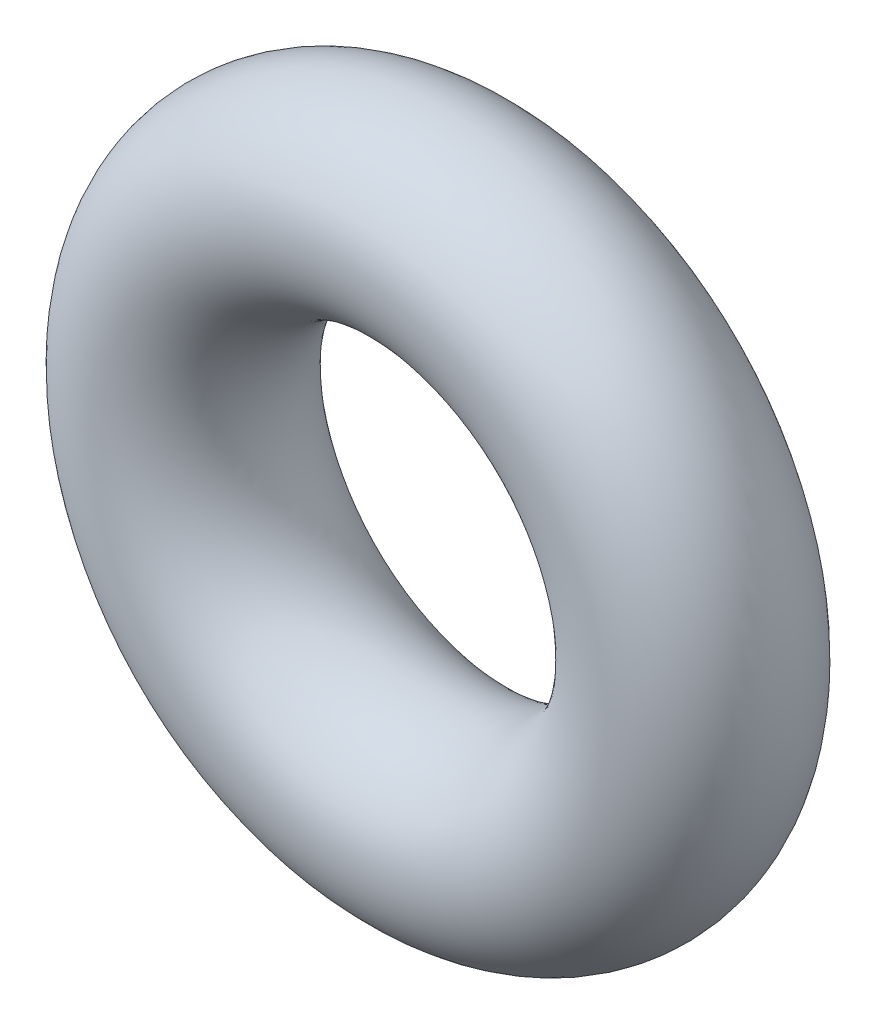
ISO-10303-21;
HEADER;
FILE_DESCRIPTION(('STEP AP214'),'2;1');
FILE_NAME('part.step','',(''),(''),'','','');
FILE_SCHEMA(('AUTOMOTIVE_DESIGN { 1 0 10303 214 1 1 1 1 }'));
ENDSEC;
DATA;
#1=APPLICATION_CONTEXT('core data for automotive mechanical design processes');
#2=APPLICATION_PROTOCOL_DEFINITION('international standard','automotive_design',2000,#1);
#3=PRODUCT_CONTEXT('',#1,'mechanical');
#4=PRODUCT('Part','Part','',(#3));
#5=PRODUCT_RELATED_PRODUCT_CATEGORY('part','',(#4));
#6=PRODUCT_DEFINITION_FORMATION('','',#4);
#7=PRODUCT_DEFINITION_CONTEXT('part definition',#1,'design');
#8=PRODUCT_DEFINITION('design','',#6,#7);
#9=PRODUCT_DEFINITION_SHAPE('','',#8);
#10=(LENGTH_UNIT() NAMED_UNIT(*) SI_UNIT(.MILLI.,.METRE.));
#11=(NAMED_UNIT(*) PLANE_ANGLE_UNIT() SI_UNIT($,.RADIAN.));
#12=(NAMED_UNIT(*) SI_UNIT($,.STERADIAN.) SOLID_ANGLE_UNIT());
#13=UNCERTAINTY_MEASURE_WITH_UNIT(LENGTH_MEASURE(1.E-05),#10,'distance_accuracy_value','');
#14=(GEOMETRIC_REPRESENTATION_CONTEXT(3) GLOBAL_UNCERTAINTY_ASSIGNED_CONTEXT((#13)) GLOBAL_UNIT_ASSIGNED_CONTEXT((#10,
#11,#12)) REPRESENTATION_CONTEXT('',''));
#15=CARTESIAN_POINT('',(0.,0.,0.));
#16=DIRECTION('',(0.,0.,1.));
#17=DIRECTION('',(1.,0.,0.));
#18=AXIS2_PLACEMENT_3D('',#15,#16,#17);
#19=CARTESIAN_POINT('',(0.,0.,0.));
#20=DIRECTION('',(0.,0.,1.));
#21=DIRECTION('',(1.,0.,0.));
#22=AXIS2_PLACEMENT_3D('',#19,#20,#21);
#23=TOROIDAL_SURFACE('',#22,2.3368,0.889);
#24=CARTESIAN_POINT('',(3.2258,0.,0.));
#25=VERTEX_POINT('',#24);
#26=VERTEX_LOOP('',#25);
#27=FACE_BOUND('',#26,.T.);
#28=ADVANCED_FACE('F34',(#27),#23,.T.);
#29=CLOSED_SHELL('',(#28));
#30=MANIFOLD_SOLID_BREP('B2',#29);
#31=ADVANCED_BREP_SHAPE_REPRESENTATION('',(#18,#30),#14);
#32=SHAPE_DEFINITION_REPRESENTATION(#9,#31);
ENDSEC;
END-ISO-10303-21;
